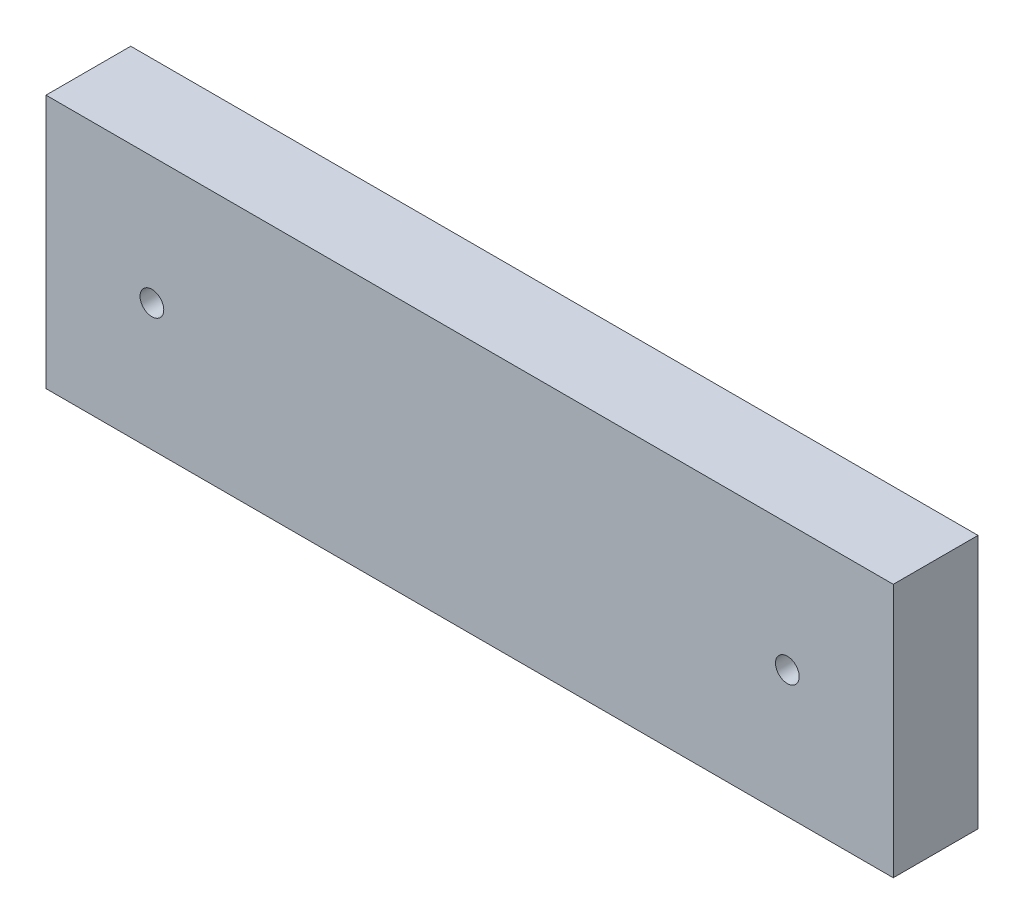
ISO-10303-21;
HEADER;
FILE_DESCRIPTION(('STEP AP214'),'2;1');
FILE_NAME('part.step','',(''),(''),'','','');
FILE_SCHEMA(('AUTOMOTIVE_DESIGN { 1 0 10303 214 1 1 1 1 }'));
ENDSEC;
DATA;
#1=APPLICATION_CONTEXT('core data for automotive mechanical design processes');
#2=APPLICATION_PROTOCOL_DEFINITION('international standard','automotive_design',2000,#1);
#3=PRODUCT_CONTEXT('',#1,'mechanical');
#4=PRODUCT('Part','Part','',(#3));
#5=PRODUCT_RELATED_PRODUCT_CATEGORY('part','',(#4));
#6=PRODUCT_DEFINITION_FORMATION('','',#4);
#7=PRODUCT_DEFINITION_CONTEXT('part definition',#1,'design');
#8=PRODUCT_DEFINITION('design','',#6,#7);
#9=PRODUCT_DEFINITION_SHAPE('','',#8);
#10=(LENGTH_UNIT() NAMED_UNIT(*) SI_UNIT(.MILLI.,.METRE.));
#11=(NAMED_UNIT(*) PLANE_ANGLE_UNIT() SI_UNIT($,.RADIAN.));
#12=(NAMED_UNIT(*) SI_UNIT($,.STERADIAN.) SOLID_ANGLE_UNIT());
#13=UNCERTAINTY_MEASURE_WITH_UNIT(LENGTH_MEASURE(1.E-05),#10,'distance_accuracy_value','');
#14=(GEOMETRIC_REPRESENTATION_CONTEXT(3) GLOBAL_UNCERTAINTY_ASSIGNED_CONTEXT((#13)) GLOBAL_UNIT_ASSIGNED_CONTEXT((#10,
#11,#12)) REPRESENTATION_CONTEXT('',''));
#15=CARTESIAN_POINT('',(0.,0.,0.));
#16=DIRECTION('',(0.,0.,1.));
#17=DIRECTION('',(1.,0.,0.));
#18=AXIS2_PLACEMENT_3D('',#15,#16,#17);
#19=CARTESIAN_POINT('',(0.,0.,10.));
#20=DIRECTION('',(0.,0.,1.));
#21=DIRECTION('',(1.,0.,0.));
#22=AXIS2_PLACEMENT_3D('',#19,#20,#21);
#23=PLANE('',#22);
#24=CARTESIAN_POINT('',(-37.5,0.,10.));
#25=DIRECTION('',(0.,0.,1.));
#26=DIRECTION('',(1.,0.,0.));
#27=AXIS2_PLACEMENT_3D('',#24,#25,#26);
#28=CIRCLE('',#27,1.4);
#29=CARTESIAN_POINT('',(-36.1,0.,10.));
#30=VERTEX_POINT('',#29);
#31=EDGE_CURVE('E112',#30,#30,#28,.T.);
#32=ORIENTED_EDGE('',*,*,#31,.F.);
#33=EDGE_LOOP('',(#32));
#34=FACE_BOUND('',#33,.T.);
#35=DIRECTION('',(0.,1.,0.));
#36=VECTOR('',#35,1.);
#37=CARTESIAN_POINT('',(50.,15.,10.));
#38=LINE('',#37,#36);
#39=CARTESIAN_POINT('',(50.,-15.,10.));
#40=VERTEX_POINT('',#39);
#41=CARTESIAN_POINT('',(50.,15.,10.));
#42=VERTEX_POINT('',#41);
#43=EDGE_CURVE('E92',#40,#42,#38,.T.);
#44=ORIENTED_EDGE('',*,*,#43,.T.);
#45=DIRECTION('',(-1.,0.,0.));
#46=VECTOR('',#45,1.);
#47=CARTESIAN_POINT('',(-50.,15.,10.));
#48=LINE('',#47,#46);
#49=CARTESIAN_POINT('',(-50.,15.,10.));
#50=VERTEX_POINT('',#49);
#51=EDGE_CURVE('E87',#42,#50,#48,.T.);
#52=ORIENTED_EDGE('',*,*,#51,.T.);
#53=DIRECTION('',(0.,-1.,0.));
#54=VECTOR('',#53,1.);
#55=CARTESIAN_POINT('',(-50.,15.,10.));
#56=LINE('',#55,#54);
#57=CARTESIAN_POINT('',(-50.,-15.,10.));
#58=VERTEX_POINT('',#57);
#59=EDGE_CURVE('E90',#50,#58,#56,.T.);
#60=ORIENTED_EDGE('',*,*,#59,.T.);
#61=DIRECTION('',(1.,0.,0.));
#62=VECTOR('',#61,1.);
#63=CARTESIAN_POINT('',(-50.,-15.,10.));
#64=LINE('',#63,#62);
#65=EDGE_CURVE('E57',#58,#40,#64,.T.);
#66=ORIENTED_EDGE('',*,*,#65,.T.);
#67=EDGE_LOOP('',(#44,#52,#60,#66));
#68=FACE_BOUND('',#67,.T.);
#69=CARTESIAN_POINT('',(37.5,0.,10.));
#70=DIRECTION('',(0.,0.,1.));
#71=DIRECTION('',(-1.,0.,0.));
#72=AXIS2_PLACEMENT_3D('',#69,#70,#71);
#73=CIRCLE('',#72,1.4);
#74=CARTESIAN_POINT('',(36.1,0.,10.));
#75=VERTEX_POINT('',#74);
#76=EDGE_CURVE('E134',#75,#75,#73,.T.);
#77=ORIENTED_EDGE('',*,*,#76,.F.);
#78=EDGE_LOOP('',(#77));
#79=FACE_BOUND('',#78,.T.);
#80=ADVANCED_FACE('F39',(#34,#68,#79),#23,.T.);
#81=CARTESIAN_POINT('',(0.,0.,0.));
#82=DIRECTION('',(0.,0.,1.));
#83=DIRECTION('',(1.,0.,0.));
#84=AXIS2_PLACEMENT_3D('',#81,#82,#83);
#85=PLANE('',#84);
#86=DIRECTION('',(0.,1.,0.));
#87=VECTOR('',#86,1.);
#88=CARTESIAN_POINT('',(50.,15.,0.));
#89=LINE('',#88,#87);
#90=CARTESIAN_POINT('',(50.,-15.,0.));
#91=VERTEX_POINT('',#90);
#92=CARTESIAN_POINT('',(50.,15.,0.));
#93=VERTEX_POINT('',#92);
#94=EDGE_CURVE('E108',#91,#93,#89,.T.);
#95=ORIENTED_EDGE('',*,*,#94,.F.);
#96=DIRECTION('',(1.,0.,0.));
#97=VECTOR('',#96,1.);
#98=CARTESIAN_POINT('',(-50.,-15.,0.));
#99=LINE('',#98,#97);
#100=CARTESIAN_POINT('',(-50.,-15.,0.));
#101=VERTEX_POINT('',#100);
#102=EDGE_CURVE('E80',#101,#91,#99,.T.);
#103=ORIENTED_EDGE('',*,*,#102,.F.);
#104=DIRECTION('',(0.,-1.,0.));
#105=VECTOR('',#104,1.);
#106=CARTESIAN_POINT('',(-50.,15.,0.));
#107=LINE('',#106,#105);
#108=CARTESIAN_POINT('',(-50.,15.,0.));
#109=VERTEX_POINT('',#108);
#110=EDGE_CURVE('E74',#109,#101,#107,.T.);
#111=ORIENTED_EDGE('',*,*,#110,.F.);
#112=DIRECTION('',(-1.,0.,0.));
#113=VECTOR('',#112,1.);
#114=CARTESIAN_POINT('',(-50.,15.,0.));
#115=LINE('',#114,#113);
#116=EDGE_CURVE('E97',#93,#109,#115,.T.);
#117=ORIENTED_EDGE('',*,*,#116,.F.);
#118=EDGE_LOOP('',(#95,#103,#111,#117));
#119=FACE_BOUND('',#118,.T.);
#120=CARTESIAN_POINT('',(-37.5,0.,0.));
#121=DIRECTION('',(0.,0.,1.));
#122=DIRECTION('',(1.,0.,0.));
#123=AXIS2_PLACEMENT_3D('',#120,#121,#122);
#124=CIRCLE('',#123,1.4);
#125=CARTESIAN_POINT('',(-36.1,0.,0.));
#126=VERTEX_POINT('',#125);
#127=EDGE_CURVE('E130',#126,#126,#124,.T.);
#128=ORIENTED_EDGE('',*,*,#127,.T.);
#129=EDGE_LOOP('',(#128));
#130=FACE_BOUND('',#129,.T.);
#131=CARTESIAN_POINT('',(37.5,0.,0.));
#132=DIRECTION('',(0.,0.,1.));
#133=DIRECTION('',(-1.,0.,0.));
#134=AXIS2_PLACEMENT_3D('',#131,#132,#133);
#135=CIRCLE('',#134,1.4);
#136=CARTESIAN_POINT('',(36.1,0.,0.));
#137=VERTEX_POINT('',#136);
#138=EDGE_CURVE('E138',#137,#137,#135,.T.);
#139=ORIENTED_EDGE('',*,*,#138,.T.);
#140=EDGE_LOOP('',(#139));
#141=FACE_BOUND('',#140,.T.);
#142=ADVANCED_FACE('F125',(#119,#130,#141),#85,.F.);
#143=CARTESIAN_POINT('',(50.,15.,10.));
#144=DIRECTION('',(-1.,0.,0.));
#145=DIRECTION('',(0.,0.,1.));
#146=AXIS2_PLACEMENT_3D('',#143,#144,#145);
#147=PLANE('',#146);
#148=ORIENTED_EDGE('',*,*,#94,.T.);
#149=DIRECTION('',(0.,0.,-1.));
#150=VECTOR('',#149,1.);
#151=CARTESIAN_POINT('',(50.,15.,10.));
#152=LINE('',#151,#150);
#153=EDGE_CURVE('E11',#42,#93,#152,.T.);
#154=ORIENTED_EDGE('',*,*,#153,.F.);
#155=ORIENTED_EDGE('',*,*,#43,.F.);
#156=DIRECTION('',(0.,0.,-1.));
#157=VECTOR('',#156,1.);
#158=CARTESIAN_POINT('',(50.,-15.,10.));
#159=LINE('',#158,#157);
#160=EDGE_CURVE('E104',#40,#91,#159,.T.);
#161=ORIENTED_EDGE('',*,*,#160,.T.);
#162=EDGE_LOOP('',(#148,#154,#155,#161));
#163=FACE_BOUND('',#162,.T.);
#164=ADVANCED_FACE('F41',(#163),#147,.F.);
#165=CARTESIAN_POINT('',(-50.,15.,10.));
#166=DIRECTION('',(0.,-1.,0.));
#167=DIRECTION('',(1.,0.,0.));
#168=AXIS2_PLACEMENT_3D('',#165,#166,#167);
#169=PLANE('',#168);
#170=ORIENTED_EDGE('',*,*,#116,.T.);
#171=DIRECTION('',(0.,0.,-1.));
#172=VECTOR('',#171,1.);
#173=CARTESIAN_POINT('',(-50.,15.,10.));
#174=LINE('',#173,#172);
#175=EDGE_CURVE('E49',#50,#109,#174,.T.);
#176=ORIENTED_EDGE('',*,*,#175,.F.);
#177=ORIENTED_EDGE('',*,*,#51,.F.);
#178=ORIENTED_EDGE('',*,*,#153,.T.);
#179=EDGE_LOOP('',(#170,#176,#177,#178));
#180=FACE_BOUND('',#179,.T.);
#181=ADVANCED_FACE('F96',(#180),#169,.F.);
#182=CARTESIAN_POINT('',(-50.,15.,10.));
#183=DIRECTION('',(1.,0.,0.));
#184=DIRECTION('',(0.,0.,-1.));
#185=AXIS2_PLACEMENT_3D('',#182,#183,#184);
#186=PLANE('',#185);
#187=ORIENTED_EDGE('',*,*,#110,.T.);
#188=DIRECTION('',(0.,0.,-1.));
#189=VECTOR('',#188,1.);
#190=CARTESIAN_POINT('',(-50.,-15.,10.));
#191=LINE('',#190,#189);
#192=EDGE_CURVE('E99',#58,#101,#191,.T.);
#193=ORIENTED_EDGE('',*,*,#192,.F.);
#194=ORIENTED_EDGE('',*,*,#59,.F.);
#195=ORIENTED_EDGE('',*,*,#175,.T.);
#196=EDGE_LOOP('',(#187,#193,#194,#195));
#197=FACE_BOUND('',#196,.T.);
#198=ADVANCED_FACE('F100',(#197),#186,.F.);
#199=CARTESIAN_POINT('',(-50.,-15.,10.));
#200=DIRECTION('',(0.,1.,0.));
#201=DIRECTION('',(-1.,0.,0.));
#202=AXIS2_PLACEMENT_3D('',#199,#200,#201);
#203=PLANE('',#202);
#204=ORIENTED_EDGE('',*,*,#102,.T.);
#205=ORIENTED_EDGE('',*,*,#160,.F.);
#206=ORIENTED_EDGE('',*,*,#65,.F.);
#207=ORIENTED_EDGE('',*,*,#192,.T.);
#208=EDGE_LOOP('',(#204,#205,#206,#207));
#209=FACE_BOUND('',#208,.T.);
#210=ADVANCED_FACE('F122',(#209),#203,.F.);
#211=CARTESIAN_POINT('',(-37.5,0.,10.));
#212=DIRECTION('',(0.,0.,-1.));
#213=DIRECTION('',(-1.,0.,0.));
#214=AXIS2_PLACEMENT_3D('',#211,#212,#213);
#215=CYLINDRICAL_SURFACE('',#214,1.4);
#216=ORIENTED_EDGE('',*,*,#31,.T.);
#217=EDGE_LOOP('',(#216));
#218=FACE_BOUND('',#217,.T.);
#219=ORIENTED_EDGE('',*,*,#127,.F.);
#220=EDGE_LOOP('',(#219));
#221=FACE_BOUND('',#220,.T.);
#222=ADVANCED_FACE('F157',(#218,#221),#215,.F.);
#223=CARTESIAN_POINT('',(37.5,0.,10.));
#224=DIRECTION('',(0.,0.,-1.));
#225=DIRECTION('',(-1.,0.,0.));
#226=AXIS2_PLACEMENT_3D('',#223,#224,#225);
#227=CYLINDRICAL_SURFACE('',#226,1.4);
#228=ORIENTED_EDGE('',*,*,#76,.T.);
#229=EDGE_LOOP('',(#228));
#230=FACE_BOUND('',#229,.T.);
#231=ORIENTED_EDGE('',*,*,#138,.F.);
#232=EDGE_LOOP('',(#231));
#233=FACE_BOUND('',#232,.T.);
#234=ADVANCED_FACE('F146',(#230,#233),#227,.F.);
#235=CLOSED_SHELL('',(#80,#142,#164,#181,#198,#210,#222,#234));
#236=MANIFOLD_SOLID_BREP('B2',#235);
#237=ADVANCED_BREP_SHAPE_REPRESENTATION('',(#18,#236),#14);
#238=SHAPE_DEFINITION_REPRESENTATION(#9,#237);
ENDSEC;
END-ISO-10303-21;
